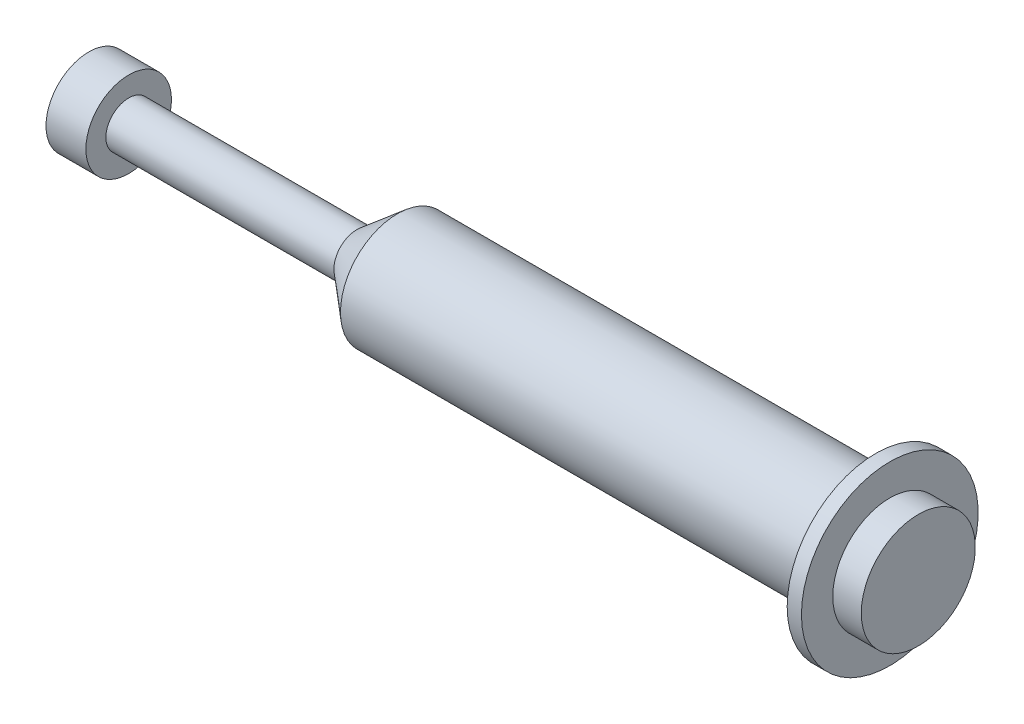
ISO-10303-21;
HEADER;
FILE_DESCRIPTION(('STEP AP214'),'2;1');
FILE_NAME('part.step','',(''),(''),'','','');
FILE_SCHEMA(('AUTOMOTIVE_DESIGN { 1 0 10303 214 1 1 1 1 }'));
ENDSEC;
DATA;
#1=APPLICATION_CONTEXT('core data for automotive mechanical design processes');
#2=APPLICATION_PROTOCOL_DEFINITION('international standard','automotive_design',2000,#1);
#3=PRODUCT_CONTEXT('',#1,'mechanical');
#4=PRODUCT('Part','Part','',(#3));
#5=PRODUCT_RELATED_PRODUCT_CATEGORY('part','',(#4));
#6=PRODUCT_DEFINITION_FORMATION('','',#4);
#7=PRODUCT_DEFINITION_CONTEXT('part definition',#1,'design');
#8=PRODUCT_DEFINITION('design','',#6,#7);
#9=PRODUCT_DEFINITION_SHAPE('','',#8);
#10=(LENGTH_UNIT() NAMED_UNIT(*) SI_UNIT(.MILLI.,.METRE.));
#11=(NAMED_UNIT(*) PLANE_ANGLE_UNIT() SI_UNIT($,.RADIAN.));
#12=(NAMED_UNIT(*) SI_UNIT($,.STERADIAN.) SOLID_ANGLE_UNIT());
#13=UNCERTAINTY_MEASURE_WITH_UNIT(LENGTH_MEASURE(1.E-05),#10,'distance_accuracy_value','');
#14=(GEOMETRIC_REPRESENTATION_CONTEXT(3) GLOBAL_UNCERTAINTY_ASSIGNED_CONTEXT((#13)) GLOBAL_UNIT_ASSIGNED_CONTEXT((#10,
#11,#12)) REPRESENTATION_CONTEXT('',''));
#15=CARTESIAN_POINT('',(0.,0.,0.));
#16=DIRECTION('',(0.,0.,1.));
#17=DIRECTION('',(1.,0.,0.));
#18=AXIS2_PLACEMENT_3D('',#15,#16,#17);
#19=CARTESIAN_POINT('',(-9.4,0.,0.));
#20=DIRECTION('',(-1.,0.,0.));
#21=DIRECTION('',(0.,0.,1.));
#22=AXIS2_PLACEMENT_3D('',#19,#20,#21);
#23=PLANE('',#22);
#24=CARTESIAN_POINT('',(-9.4,0.,0.));
#25=DIRECTION('',(-1.,0.,0.));
#26=DIRECTION('',(0.,0.,1.));
#27=AXIS2_PLACEMENT_3D('',#24,#25,#26);
#28=CIRCLE('',#27,1.5);
#29=CARTESIAN_POINT('',(-9.4,0.,1.5));
#30=VERTEX_POINT('',#29);
#31=EDGE_CURVE('E67',#30,#30,#28,.T.);
#32=ORIENTED_EDGE('',*,*,#31,.T.);
#33=EDGE_LOOP('',(#32));
#34=FACE_BOUND('',#33,.T.);
#35=ADVANCED_FACE('F33',(#34),#23,.T.);
#36=CARTESIAN_POINT('',(19.7,0.,0.));
#37=DIRECTION('',(1.,0.,0.));
#38=DIRECTION('',(0.,0.,-1.));
#39=AXIS2_PLACEMENT_3D('',#36,#37,#38);
#40=PLANE('',#39);
#41=CARTESIAN_POINT('',(19.7,0.,0.));
#42=DIRECTION('',(-1.,0.,0.));
#43=DIRECTION('',(0.,0.,1.));
#44=AXIS2_PLACEMENT_3D('',#41,#42,#43);
#45=CIRCLE('',#44,2.);
#46=CARTESIAN_POINT('',(19.7,0.,2.));
#47=VERTEX_POINT('',#46);
#48=EDGE_CURVE('E10',#47,#47,#45,.T.);
#49=ORIENTED_EDGE('',*,*,#48,.F.);
#50=EDGE_LOOP('',(#49));
#51=FACE_BOUND('',#50,.T.);
#52=ADVANCED_FACE('F84',(#51),#40,.T.);
#53=CARTESIAN_POINT('',(0.,0.,0.));
#54=DIRECTION('',(-1.,0.,0.));
#55=DIRECTION('',(0.,0.,1.));
#56=AXIS2_PLACEMENT_3D('',#53,#54,#55);
#57=CYLINDRICAL_SURFACE('',#56,2.);
#58=ORIENTED_EDGE('',*,*,#48,.T.);
#59=EDGE_LOOP('',(#58));
#60=FACE_BOUND('',#59,.T.);
#61=CARTESIAN_POINT('',(18.7,0.,0.));
#62=DIRECTION('',(-1.,0.,0.));
#63=DIRECTION('',(0.,0.,1.));
#64=AXIS2_PLACEMENT_3D('',#61,#62,#63);
#65=CIRCLE('',#64,2.);
#66=CARTESIAN_POINT('',(18.7,0.,2.));
#67=VERTEX_POINT('',#66);
#68=EDGE_CURVE('E39',#67,#67,#65,.T.);
#69=ORIENTED_EDGE('',*,*,#68,.F.);
#70=EDGE_LOOP('',(#69));
#71=FACE_BOUND('',#70,.T.);
#72=ADVANCED_FACE('F88',(#60,#71),#57,.T.);
#73=CARTESIAN_POINT('',(18.7,0.,0.));
#74=DIRECTION('',(-1.,0.,0.));
#75=DIRECTION('',(0.,0.,1.));
#76=AXIS2_PLACEMENT_3D('',#73,#74,#75);
#77=PLANE('',#76);
#78=CARTESIAN_POINT('',(18.7,0.,0.));
#79=DIRECTION('',(-1.,0.,0.));
#80=DIRECTION('',(0.,0.,1.));
#81=AXIS2_PLACEMENT_3D('',#78,#79,#80);
#82=CIRCLE('',#81,3.1);
#83=CARTESIAN_POINT('',(18.7,0.,3.1));
#84=VERTEX_POINT('',#83);
#85=EDGE_CURVE('E43',#84,#84,#82,.T.);
#86=ORIENTED_EDGE('',*,*,#85,.F.);
#87=EDGE_LOOP('',(#86));
#88=FACE_BOUND('',#87,.T.);
#89=ORIENTED_EDGE('',*,*,#68,.T.);
#90=EDGE_LOOP('',(#89));
#91=FACE_BOUND('',#90,.T.);
#92=ADVANCED_FACE('F93',(#88,#91),#77,.F.);
#93=CARTESIAN_POINT('',(0.,0.,0.));
#94=DIRECTION('',(-1.,0.,0.));
#95=DIRECTION('',(0.,0.,1.));
#96=AXIS2_PLACEMENT_3D('',#93,#94,#95);
#97=CYLINDRICAL_SURFACE('',#96,3.1);
#98=CARTESIAN_POINT('',(18.2,0.,0.));
#99=DIRECTION('',(-1.,0.,0.));
#100=DIRECTION('',(0.,0.,1.));
#101=AXIS2_PLACEMENT_3D('',#98,#99,#100);
#102=CIRCLE('',#101,3.1);
#103=CARTESIAN_POINT('',(18.2,0.,3.1));
#104=VERTEX_POINT('',#103);
#105=EDGE_CURVE('E47',#104,#104,#102,.T.);
#106=ORIENTED_EDGE('',*,*,#105,.F.);
#107=EDGE_LOOP('',(#106));
#108=FACE_BOUND('',#107,.T.);
#109=ORIENTED_EDGE('',*,*,#85,.T.);
#110=EDGE_LOOP('',(#109));
#111=FACE_BOUND('',#110,.T.);
#112=ADVANCED_FACE('F98',(#108,#111),#97,.T.);
#113=CARTESIAN_POINT('',(18.2,0.,0.));
#114=DIRECTION('',(1.,0.,0.));
#115=DIRECTION('',(0.,0.,-1.));
#116=AXIS2_PLACEMENT_3D('',#113,#114,#115);
#117=PLANE('',#116);
#118=CARTESIAN_POINT('',(18.2,0.,0.));
#119=DIRECTION('',(-1.,0.,0.));
#120=DIRECTION('',(0.,0.,1.));
#121=AXIS2_PLACEMENT_3D('',#118,#119,#120);
#122=CIRCLE('',#121,2.);
#123=CARTESIAN_POINT('',(18.2,0.,2.));
#124=VERTEX_POINT('',#123);
#125=EDGE_CURVE('E52',#124,#124,#122,.T.);
#126=ORIENTED_EDGE('',*,*,#125,.F.);
#127=EDGE_LOOP('',(#126));
#128=FACE_BOUND('',#127,.T.);
#129=ORIENTED_EDGE('',*,*,#105,.T.);
#130=EDGE_LOOP('',(#129));
#131=FACE_BOUND('',#130,.T.);
#132=ADVANCED_FACE('F102',(#128,#131),#117,.F.);
#133=CARTESIAN_POINT('',(0.,0.,0.));
#134=DIRECTION('',(-1.,0.,0.));
#135=DIRECTION('',(0.,0.,1.));
#136=AXIS2_PLACEMENT_3D('',#133,#134,#135);
#137=CYLINDRICAL_SURFACE('',#136,2.);
#138=ORIENTED_EDGE('',*,*,#125,.T.);
#139=EDGE_LOOP('',(#138));
#140=FACE_BOUND('',#139,.T.);
#141=CARTESIAN_POINT('',(1.43010431111305,0.,0.));
#142=DIRECTION('',(-1.,0.,0.));
#143=DIRECTION('',(0.,0.,1.));
#144=AXIS2_PLACEMENT_3D('',#141,#142,#143);
#145=CIRCLE('',#144,2.);
#146=CARTESIAN_POINT('',(1.43010431111305,0.,2.));
#147=VERTEX_POINT('',#146);
#148=EDGE_CURVE('E55',#147,#147,#145,.T.);
#149=ORIENTED_EDGE('',*,*,#148,.F.);
#150=EDGE_LOOP('',(#149));
#151=FACE_BOUND('',#150,.T.);
#152=ADVANCED_FACE('F106',(#140,#151),#137,.T.);
#153=CARTESIAN_POINT('',(0.,0.,0.));
#154=DIRECTION('',(1.,0.,0.));
#155=DIRECTION('',(0.,0.,-1.));
#156=AXIS2_PLACEMENT_3D('',#153,#154,#155);
#157=CONICAL_SURFACE('',#156,0.8,0.698131700797733);
#158=ORIENTED_EDGE('',*,*,#148,.T.);
#159=EDGE_LOOP('',(#158));
#160=FACE_BOUND('',#159,.T.);
#161=CARTESIAN_POINT('',(0.,0.,0.));
#162=DIRECTION('',(-1.,0.,0.));
#163=DIRECTION('',(0.,0.,1.));
#164=AXIS2_PLACEMENT_3D('',#161,#162,#163);
#165=CIRCLE('',#164,0.8);
#166=CARTESIAN_POINT('',(0.,0.,0.8));
#167=VERTEX_POINT('',#166);
#168=EDGE_CURVE('E58',#167,#167,#165,.T.);
#169=ORIENTED_EDGE('',*,*,#168,.F.);
#170=EDGE_LOOP('',(#169));
#171=FACE_BOUND('',#170,.T.);
#172=ADVANCED_FACE('F110',(#160,#171),#157,.T.);
#173=CARTESIAN_POINT('',(0.,0.,0.));
#174=DIRECTION('',(-1.,0.,0.));
#175=DIRECTION('',(0.,0.,1.));
#176=AXIS2_PLACEMENT_3D('',#173,#174,#175);
#177=CYLINDRICAL_SURFACE('',#176,0.8);
#178=ORIENTED_EDGE('',*,*,#168,.T.);
#179=EDGE_LOOP('',(#178));
#180=FACE_BOUND('',#179,.T.);
#181=CARTESIAN_POINT('',(-8.,0.,0.));
#182=DIRECTION('',(-1.,0.,0.));
#183=DIRECTION('',(0.,0.,1.));
#184=AXIS2_PLACEMENT_3D('',#181,#182,#183);
#185=CIRCLE('',#184,0.8);
#186=CARTESIAN_POINT('',(-8.,0.,0.8));
#187=VERTEX_POINT('',#186);
#188=EDGE_CURVE('E61',#187,#187,#185,.T.);
#189=ORIENTED_EDGE('',*,*,#188,.F.);
#190=EDGE_LOOP('',(#189));
#191=FACE_BOUND('',#190,.T.);
#192=ADVANCED_FACE('F80',(#180,#191),#177,.T.);
#193=CARTESIAN_POINT('',(-8.,0.,0.));
#194=DIRECTION('',(1.,0.,0.));
#195=DIRECTION('',(0.,0.,-1.));
#196=AXIS2_PLACEMENT_3D('',#193,#194,#195);
#197=PLANE('',#196);
#198=ORIENTED_EDGE('',*,*,#188,.T.);
#199=EDGE_LOOP('',(#198));
#200=FACE_BOUND('',#199,.T.);
#201=CARTESIAN_POINT('',(-8.,0.,0.));
#202=DIRECTION('',(-1.,0.,0.));
#203=DIRECTION('',(0.,0.,1.));
#204=AXIS2_PLACEMENT_3D('',#201,#202,#203);
#205=CIRCLE('',#204,1.5);
#206=CARTESIAN_POINT('',(-8.,0.,1.5));
#207=VERTEX_POINT('',#206);
#208=EDGE_CURVE('E64',#207,#207,#205,.T.);
#209=ORIENTED_EDGE('',*,*,#208,.F.);
#210=EDGE_LOOP('',(#209));
#211=FACE_BOUND('',#210,.T.);
#212=ADVANCED_FACE('F74',(#200,#211),#197,.T.);
#213=CARTESIAN_POINT('',(0.,0.,0.));
#214=DIRECTION('',(-1.,0.,0.));
#215=DIRECTION('',(0.,0.,1.));
#216=AXIS2_PLACEMENT_3D('',#213,#214,#215);
#217=CYLINDRICAL_SURFACE('',#216,1.5);
#218=ORIENTED_EDGE('',*,*,#208,.T.);
#219=EDGE_LOOP('',(#218));
#220=FACE_BOUND('',#219,.T.);
#221=ORIENTED_EDGE('',*,*,#31,.F.);
#222=EDGE_LOOP('',(#221));
#223=FACE_BOUND('',#222,.T.);
#224=ADVANCED_FACE('F72',(#220,#223),#217,.T.);
#225=CLOSED_SHELL('',(#35,#52,#72,#92,#112,#132,#152,#172,#192,#212,#224));
#226=MANIFOLD_SOLID_BREP('B2',#225);
#227=ADVANCED_BREP_SHAPE_REPRESENTATION('',(#18,#226),#14);
#228=SHAPE_DEFINITION_REPRESENTATION(#9,#227);
ENDSEC;
END-ISO-10303-21;
